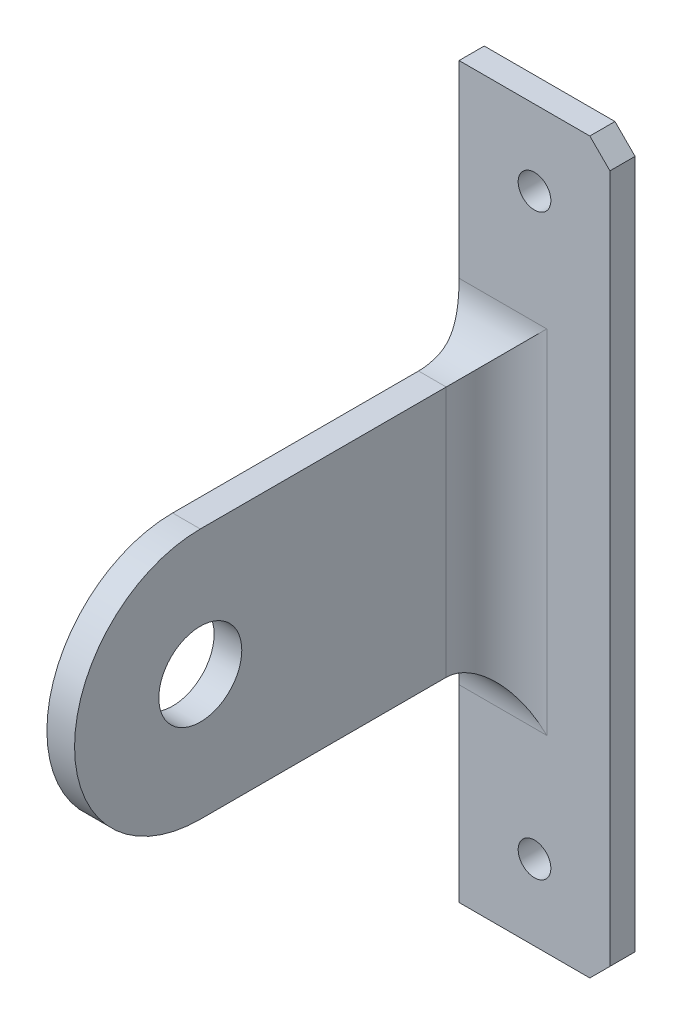
ISO-10303-21;
HEADER;
FILE_DESCRIPTION(('STEP AP214'),'2;1');
FILE_NAME('part.step','',(''),(''),'','','');
FILE_SCHEMA(('AUTOMOTIVE_DESIGN { 1 0 10303 214 1 1 1 1 }'));
ENDSEC;
DATA;
#1=APPLICATION_CONTEXT('core data for automotive mechanical design processes');
#2=APPLICATION_PROTOCOL_DEFINITION('international standard','automotive_design',2000,#1);
#3=PRODUCT_CONTEXT('',#1,'mechanical');
#4=PRODUCT('Part','Part','',(#3));
#5=PRODUCT_RELATED_PRODUCT_CATEGORY('part','',(#4));
#6=PRODUCT_DEFINITION_FORMATION('','',#4);
#7=PRODUCT_DEFINITION_CONTEXT('part definition',#1,'design');
#8=PRODUCT_DEFINITION('design','',#6,#7);
#9=PRODUCT_DEFINITION_SHAPE('','',#8);
#10=(LENGTH_UNIT() NAMED_UNIT(*) SI_UNIT(.MILLI.,.METRE.));
#11=(NAMED_UNIT(*) PLANE_ANGLE_UNIT() SI_UNIT($,.RADIAN.));
#12=(NAMED_UNIT(*) SI_UNIT($,.STERADIAN.) SOLID_ANGLE_UNIT());
#13=UNCERTAINTY_MEASURE_WITH_UNIT(LENGTH_MEASURE(1.E-05),#10,'distance_accuracy_value','');
#14=(GEOMETRIC_REPRESENTATION_CONTEXT(3) GLOBAL_UNCERTAINTY_ASSIGNED_CONTEXT((#13)) GLOBAL_UNIT_ASSIGNED_CONTEXT((#10,
#11,#12)) REPRESENTATION_CONTEXT('',''));
#15=CARTESIAN_POINT('',(0.,0.,0.));
#16=DIRECTION('',(0.,0.,1.));
#17=DIRECTION('',(1.,0.,0.));
#18=AXIS2_PLACEMENT_3D('',#15,#16,#17);
#19=CARTESIAN_POINT('',(2.75,12.5,-4.125));
#20=DIRECTION('',(-1.,0.,0.));
#21=DIRECTION('',(0.,0.,1.));
#22=AXIS2_PLACEMENT_3D('',#19,#20,#21);
#23=PLANE('',#22);
#24=CARTESIAN_POINT('',(2.75,0.,0.));
#25=DIRECTION('',(1.,0.,0.));
#26=DIRECTION('',(0.,0.,-1.));
#27=AXIS2_PLACEMENT_3D('',#24,#25,#26);
#28=CIRCLE('',#27,4.125);
#29=CARTESIAN_POINT('',(2.75,0.,-4.125));
#30=VERTEX_POINT('',#29);
#31=EDGE_CURVE('E204',#30,#30,#28,.T.);
#32=ORIENTED_EDGE('',*,*,#31,.F.);
#33=EDGE_LOOP('',(#32));
#34=FACE_BOUND('',#33,.T.);
#35=DIRECTION('',(0.,0.,-1.));
#36=VECTOR('',#35,1.);
#37=CARTESIAN_POINT('',(2.75,-12.5,-4.125));
#38=LINE('',#37,#36);
#39=CARTESIAN_POINT('',(2.75,-12.5,0.));
#40=VERTEX_POINT('',#39);
#41=CARTESIAN_POINT('',(2.75,-12.5,-24.45));
#42=VERTEX_POINT('',#41);
#43=EDGE_CURVE('E213',#40,#42,#38,.T.);
#44=ORIENTED_EDGE('',*,*,#43,.T.);
#45=DIRECTION('',(0.,-1.,0.));
#46=VECTOR('',#45,1.);
#47=CARTESIAN_POINT('',(2.75,12.5,-24.45));
#48=LINE('',#47,#46);
#49=CARTESIAN_POINT('',(2.75,12.5,-24.45));
#50=VERTEX_POINT('',#49);
#51=EDGE_CURVE('E255',#42,#50,#48,.F.);
#52=ORIENTED_EDGE('',*,*,#51,.T.);
#53=DIRECTION('',(0.,0.,-1.));
#54=VECTOR('',#53,1.);
#55=CARTESIAN_POINT('',(2.75,12.5,-4.125));
#56=LINE('',#55,#54);
#57=CARTESIAN_POINT('',(2.75,12.5,0.));
#58=VERTEX_POINT('',#57);
#59=EDGE_CURVE('E224',#58,#50,#56,.T.);
#60=ORIENTED_EDGE('',*,*,#59,.F.);
#61=CARTESIAN_POINT('',(2.75,0.,0.));
#62=DIRECTION('',(1.,0.,0.));
#63=DIRECTION('',(0.,0.,-1.));
#64=AXIS2_PLACEMENT_3D('',#61,#62,#63);
#65=CIRCLE('',#64,12.5);
#66=EDGE_CURVE('E214',#58,#40,#65,.T.);
#67=ORIENTED_EDGE('',*,*,#66,.T.);
#68=EDGE_LOOP('',(#44,#52,#60,#67));
#69=FACE_BOUND('',#68,.T.);
#70=ADVANCED_FACE('F45',(#34,#69),#23,.F.);
#71=CARTESIAN_POINT('',(0.,12.5,-4.125));
#72=DIRECTION('',(1.,0.,0.));
#73=DIRECTION('',(0.,0.,-1.));
#74=AXIS2_PLACEMENT_3D('',#71,#72,#73);
#75=PLANE('',#74);
#76=CARTESIAN_POINT('',(0.,0.,0.));
#77=DIRECTION('',(1.,0.,0.));
#78=DIRECTION('',(0.,0.,-1.));
#79=AXIS2_PLACEMENT_3D('',#76,#77,#78);
#80=CIRCLE('',#79,4.125);
#81=CARTESIAN_POINT('',(0.,0.,-4.125));
#82=VERTEX_POINT('',#81);
#83=EDGE_CURVE('E209',#82,#82,#80,.T.);
#84=ORIENTED_EDGE('',*,*,#83,.T.);
#85=EDGE_LOOP('',(#84));
#86=FACE_BOUND('',#85,.T.);
#87=DIRECTION('',(0.,0.,1.));
#88=VECTOR('',#87,1.);
#89=CARTESIAN_POINT('',(0.,12.5,-4.125));
#90=LINE('',#89,#88);
#91=CARTESIAN_POINT('',(0.,12.5,-24.45));
#92=VERTEX_POINT('',#91);
#93=CARTESIAN_POINT('',(0.,12.5,0.));
#94=VERTEX_POINT('',#93);
#95=EDGE_CURVE('E228',#92,#94,#90,.T.);
#96=ORIENTED_EDGE('',*,*,#95,.F.);
#97=CARTESIAN_POINT('',(0.,17.5,-24.45));
#98=DIRECTION('',(1.,0.,0.));
#99=DIRECTION('',(0.,0.,-1.));
#100=AXIS2_PLACEMENT_3D('',#97,#98,#99);
#101=CIRCLE('',#100,5.);
#102=CARTESIAN_POINT('',(0.,12.9352791185284,-26.4904223274257));
#103=VERTEX_POINT('',#102);
#104=EDGE_CURVE('E358',#92,#103,#101,.T.);
#105=ORIENTED_EDGE('',*,*,#104,.T.);
#106=CARTESIAN_POINT('',(0.,12.9352791185284,-26.4904223274257));
#107=CARTESIAN_POINT('',(0.,12.5,-26.4904223274257));
#108=B_SPLINE_CURVE_WITH_KNOTS('',1,(#106,#107),.UNSPECIFIED.,.F.,.F.,(2,2),(0.,1.),.UNSPECIFIED.);
#109=CARTESIAN_POINT('',(0.,12.5,-26.4904223274257));
#110=VERTEX_POINT('',#109);
#111=EDGE_CURVE('E261',#103,#110,#108,.T.);
#112=ORIENTED_EDGE('',*,*,#111,.T.);
#113=DIRECTION('',(0.,-1.,0.));
#114=VECTOR('',#113,1.);
#115=CARTESIAN_POINT('',(0.,12.5,-26.4904223274257));
#116=LINE('',#115,#114);
#117=CARTESIAN_POINT('',(0.,-12.5,-26.4904223274257));
#118=VERTEX_POINT('',#117);
#119=EDGE_CURVE('E249',#110,#118,#116,.T.);
#120=ORIENTED_EDGE('',*,*,#119,.T.);
#121=CARTESIAN_POINT('',(0.,-12.5,-26.4904223274257));
#122=CARTESIAN_POINT('',(0.,-12.9352791185284,-26.4904223274257));
#123=B_SPLINE_CURVE_WITH_KNOTS('',1,(#121,#122),.UNSPECIFIED.,.F.,.F.,(2,2),(0.,1.),.UNSPECIFIED.);
#124=CARTESIAN_POINT('',(0.,-12.9352791185284,-26.4904223274257));
#125=VERTEX_POINT('',#124);
#126=EDGE_CURVE('E266',#118,#125,#123,.T.);
#127=ORIENTED_EDGE('',*,*,#126,.T.);
#128=CARTESIAN_POINT('',(0.,-17.5,-24.45));
#129=DIRECTION('',(1.,0.,0.));
#130=DIRECTION('',(0.,0.,-1.));
#131=AXIS2_PLACEMENT_3D('',#128,#129,#130);
#132=CIRCLE('',#131,5.);
#133=CARTESIAN_POINT('',(0.,-12.5,-24.45));
#134=VERTEX_POINT('',#133);
#135=EDGE_CURVE('E258',#125,#134,#132,.T.);
#136=ORIENTED_EDGE('',*,*,#135,.T.);
#137=DIRECTION('',(0.,0.,1.));
#138=VECTOR('',#137,1.);
#139=CARTESIAN_POINT('',(0.,-12.5,-4.125));
#140=LINE('',#139,#138);
#141=CARTESIAN_POINT('',(0.,-12.5,0.));
#142=VERTEX_POINT('',#141);
#143=EDGE_CURVE('E229',#134,#142,#140,.T.);
#144=ORIENTED_EDGE('',*,*,#143,.T.);
#145=CARTESIAN_POINT('',(0.,0.,0.));
#146=DIRECTION('',(1.,0.,0.));
#147=DIRECTION('',(0.,0.,-1.));
#148=AXIS2_PLACEMENT_3D('',#145,#146,#147);
#149=CIRCLE('',#148,12.5);
#150=EDGE_CURVE('E199',#94,#142,#149,.T.);
#151=ORIENTED_EDGE('',*,*,#150,.F.);
#152=EDGE_LOOP('',(#96,#105,#112,#120,#127,#136,#144,#151));
#153=FACE_BOUND('',#152,.T.);
#154=ADVANCED_FACE('F269',(#86,#153),#75,.F.);
#155=CARTESIAN_POINT('',(2.75,12.5,-31.95));
#156=DIRECTION('',(0.,0.,1.));
#157=DIRECTION('',(1.,0.,0.));
#158=AXIS2_PLACEMENT_3D('',#155,#156,#157);
#159=PLANE('',#158);
#160=CARTESIAN_POINT('',(6.53,-28.75,-31.95));
#161=DIRECTION('',(0.,0.,1.));
#162=DIRECTION('',(-1.,0.,0.));
#163=AXIS2_PLACEMENT_3D('',#160,#161,#162);
#164=CIRCLE('',#163,1.625);
#165=CARTESIAN_POINT('',(4.905,-28.75,-31.95));
#166=VERTEX_POINT('',#165);
#167=EDGE_CURVE('E412',#166,#166,#164,.T.);
#168=ORIENTED_EDGE('',*,*,#167,.T.);
#169=EDGE_LOOP('',(#168));
#170=FACE_BOUND('',#169,.T.);
#171=CARTESIAN_POINT('',(6.53,28.75,-31.95));
#172=DIRECTION('',(0.,0.,-1.));
#173=DIRECTION('',(-1.,0.,0.));
#174=AXIS2_PLACEMENT_3D('',#171,#172,#173);
#175=CIRCLE('',#174,1.625);
#176=CARTESIAN_POINT('',(4.905,28.75,-31.95));
#177=VERTEX_POINT('',#176);
#178=EDGE_CURVE('E403',#177,#177,#175,.T.);
#179=ORIENTED_EDGE('',*,*,#178,.F.);
#180=EDGE_LOOP('',(#179));
#181=FACE_BOUND('',#180,.T.);
#182=DIRECTION('',(0.,-1.,0.));
#183=VECTOR('',#182,1.);
#184=CARTESIAN_POINT('',(14.03,12.5,-31.95));
#185=LINE('',#184,#183);
#186=CARTESIAN_POINT('',(14.03,34.25,-31.95));
#187=VERTEX_POINT('',#186);
#188=CARTESIAN_POINT('',(14.03,-34.25,-31.95));
#189=VERTEX_POINT('',#188);
#190=EDGE_CURVE('E195',#187,#189,#185,.T.);
#191=ORIENTED_EDGE('',*,*,#190,.T.);
#192=DIRECTION('',(0.70710678118655,0.707106781186545,0.));
#193=VECTOR('',#192,1.);
#194=CARTESIAN_POINT('',(14.03,-34.25,-31.95));
#195=LINE('',#194,#193);
#196=CARTESIAN_POINT('',(12.03,-36.25,-31.95));
#197=VERTEX_POINT('',#196);
#198=EDGE_CURVE('E349',#189,#197,#195,.F.);
#199=ORIENTED_EDGE('',*,*,#198,.T.);
#200=DIRECTION('',(1.,0.,0.));
#201=VECTOR('',#200,1.);
#202=CARTESIAN_POINT('',(-0.97,-36.25,-31.95));
#203=LINE('',#202,#201);
#204=CARTESIAN_POINT('',(-0.97,-36.25,-31.95));
#205=VERTEX_POINT('',#204);
#206=EDGE_CURVE('E169',#205,#197,#203,.T.);
#207=ORIENTED_EDGE('',*,*,#206,.F.);
#208=DIRECTION('',(0.,-1.,0.));
#209=VECTOR('',#208,1.);
#210=CARTESIAN_POINT('',(-0.97,12.5,-31.95));
#211=LINE('',#210,#209);
#212=CARTESIAN_POINT('',(-0.97,36.25,-31.95));
#213=VERTEX_POINT('',#212);
#214=EDGE_CURVE('E173',#213,#205,#211,.T.);
#215=ORIENTED_EDGE('',*,*,#214,.F.);
#216=DIRECTION('',(1.,0.,0.));
#217=VECTOR('',#216,1.);
#218=CARTESIAN_POINT('',(14.03,36.25,-31.95));
#219=LINE('',#218,#217);
#220=CARTESIAN_POINT('',(12.03,36.25,-31.95));
#221=VERTEX_POINT('',#220);
#222=EDGE_CURVE('E175',#213,#221,#219,.T.);
#223=ORIENTED_EDGE('',*,*,#222,.T.);
#224=DIRECTION('',(0.707106781186545,-0.70710678118655,0.));
#225=VECTOR('',#224,1.);
#226=CARTESIAN_POINT('',(12.03,36.25,-31.95));
#227=LINE('',#226,#225);
#228=EDGE_CURVE('E352',#221,#187,#227,.T.);
#229=ORIENTED_EDGE('',*,*,#228,.T.);
#230=EDGE_LOOP('',(#191,#199,#207,#215,#223,#229));
#231=FACE_BOUND('',#230,.T.);
#232=ADVANCED_FACE('F279',(#170,#181,#231),#159,.F.);
#233=CARTESIAN_POINT('',(0.,12.5,0.));
#234=DIRECTION('',(0.,1.,0.));
#235=DIRECTION('',(0.,0.,1.));
#236=AXIS2_PLACEMENT_3D('',#233,#234,#235);
#237=PLANE('',#236);
#238=ORIENTED_EDGE('',*,*,#59,.T.);
#239=DIRECTION('',(-1.,0.,0.));
#240=VECTOR('',#239,1.);
#241=CARTESIAN_POINT('',(0.,12.5,-24.45));
#242=LINE('',#241,#240);
#243=EDGE_CURVE('E252',#50,#92,#242,.T.);
#244=ORIENTED_EDGE('',*,*,#243,.T.);
#245=ORIENTED_EDGE('',*,*,#95,.T.);
#246=DIRECTION('',(-1.,0.,0.));
#247=VECTOR('',#246,1.);
#248=CARTESIAN_POINT('',(2.75,12.5,0.));
#249=LINE('',#248,#247);
#250=EDGE_CURVE('E205',#58,#94,#249,.T.);
#251=ORIENTED_EDGE('',*,*,#250,.F.);
#252=EDGE_LOOP('',(#238,#244,#245,#251));
#253=FACE_BOUND('',#252,.T.);
#254=ADVANCED_FACE('F286',(#253),#237,.T.);
#255=CARTESIAN_POINT('',(0.,-12.5,0.));
#256=DIRECTION('',(0.,1.,0.));
#257=DIRECTION('',(0.,0.,1.));
#258=AXIS2_PLACEMENT_3D('',#255,#256,#257);
#259=PLANE('',#258);
#260=ORIENTED_EDGE('',*,*,#143,.F.);
#261=DIRECTION('',(-1.,0.,0.));
#262=VECTOR('',#261,1.);
#263=CARTESIAN_POINT('',(2.75,-12.5,-24.45));
#264=LINE('',#263,#262);
#265=EDGE_CURVE('E245',#134,#42,#264,.F.);
#266=ORIENTED_EDGE('',*,*,#265,.T.);
#267=ORIENTED_EDGE('',*,*,#43,.F.);
#268=DIRECTION('',(-1.,0.,0.));
#269=VECTOR('',#268,1.);
#270=CARTESIAN_POINT('',(2.75,-12.5,0.));
#271=LINE('',#270,#269);
#272=EDGE_CURVE('E200',#40,#142,#271,.T.);
#273=ORIENTED_EDGE('',*,*,#272,.T.);
#274=EDGE_LOOP('',(#260,#266,#267,#273));
#275=FACE_BOUND('',#274,.T.);
#276=ADVANCED_FACE('F281',(#275),#259,.F.);
#277=CARTESIAN_POINT('',(2.75,0.,0.));
#278=DIRECTION('',(-1.,0.,0.));
#279=DIRECTION('',(0.,0.,1.));
#280=AXIS2_PLACEMENT_3D('',#277,#278,#279);
#281=CYLINDRICAL_SURFACE('',#280,12.5);
#282=ORIENTED_EDGE('',*,*,#150,.T.);
#283=ORIENTED_EDGE('',*,*,#272,.F.);
#284=ORIENTED_EDGE('',*,*,#66,.F.);
#285=ORIENTED_EDGE('',*,*,#250,.T.);
#286=EDGE_LOOP('',(#282,#283,#284,#285));
#287=FACE_BOUND('',#286,.T.);
#288=ADVANCED_FACE('F384',(#287),#281,.T.);
#289=CARTESIAN_POINT('',(2.75,0.,0.));
#290=DIRECTION('',(-1.,0.,0.));
#291=DIRECTION('',(0.,0.,1.));
#292=AXIS2_PLACEMENT_3D('',#289,#290,#291);
#293=CYLINDRICAL_SURFACE('',#292,4.125);
#294=ORIENTED_EDGE('',*,*,#31,.T.);
#295=EDGE_LOOP('',(#294));
#296=FACE_BOUND('',#295,.T.);
#297=ORIENTED_EDGE('',*,*,#83,.F.);
#298=EDGE_LOOP('',(#297));
#299=FACE_BOUND('',#298,.T.);
#300=ADVANCED_FACE('F430',(#296,#299),#293,.F.);
#301=CARTESIAN_POINT('',(-0.97,12.5,-31.95));
#302=DIRECTION('',(1.,0.,0.));
#303=DIRECTION('',(0.,0.,-1.));
#304=AXIS2_PLACEMENT_3D('',#301,#302,#303);
#305=PLANE('',#304);
#306=ORIENTED_EDGE('',*,*,#214,.T.);
#307=DIRECTION('',(0.,0.,-1.));
#308=VECTOR('',#307,1.);
#309=CARTESIAN_POINT('',(-0.97,-36.25,-29.45));
#310=LINE('',#309,#308);
#311=CARTESIAN_POINT('',(-0.97,-36.25,-29.45));
#312=VERTEX_POINT('',#311);
#313=EDGE_CURVE('E166',#312,#205,#310,.T.);
#314=ORIENTED_EDGE('',*,*,#313,.F.);
#315=DIRECTION('',(0.,-1.,0.));
#316=VECTOR('',#315,1.);
#317=CARTESIAN_POINT('',(-0.97,12.5,-29.45));
#318=LINE('',#317,#316);
#319=CARTESIAN_POINT('',(-0.97,-17.5,-29.45));
#320=VERTEX_POINT('',#319);
#321=EDGE_CURVE('E151',#320,#312,#318,.T.);
#322=ORIENTED_EDGE('',*,*,#321,.F.);
#323=CARTESIAN_POINT('',(-0.97,17.5,-29.45));
#324=VERTEX_POINT('',#323);
#325=EDGE_CURVE('E160',#324,#320,#318,.T.);
#326=ORIENTED_EDGE('',*,*,#325,.F.);
#327=CARTESIAN_POINT('',(-0.97,36.25,-29.45));
#328=VERTEX_POINT('',#327);
#329=EDGE_CURVE('E163',#328,#324,#318,.T.);
#330=ORIENTED_EDGE('',*,*,#329,.F.);
#331=DIRECTION('',(0.,0.,-1.));
#332=VECTOR('',#331,1.);
#333=CARTESIAN_POINT('',(-0.97,36.25,-29.45));
#334=LINE('',#333,#332);
#335=EDGE_CURVE('E184',#328,#213,#334,.T.);
#336=ORIENTED_EDGE('',*,*,#335,.T.);
#337=EDGE_LOOP('',(#306,#314,#322,#326,#330,#336));
#338=FACE_BOUND('',#337,.T.);
#339=ADVANCED_FACE('F171',(#338),#305,.F.);
#340=CARTESIAN_POINT('',(14.03,12.5,-29.45));
#341=DIRECTION('',(0.,0.,-1.));
#342=DIRECTION('',(-1.,0.,0.));
#343=AXIS2_PLACEMENT_3D('',#340,#341,#342);
#344=PLANE('',#343);
#345=CARTESIAN_POINT('',(6.53,-28.75,-29.45));
#346=DIRECTION('',(0.,0.,1.));
#347=DIRECTION('',(-1.,0.,0.));
#348=AXIS2_PLACEMENT_3D('',#345,#346,#347);
#349=CIRCLE('',#348,1.625);
#350=CARTESIAN_POINT('',(4.905,-28.75,-29.45));
#351=VERTEX_POINT('',#350);
#352=EDGE_CURVE('E409',#351,#351,#349,.T.);
#353=ORIENTED_EDGE('',*,*,#352,.F.);
#354=EDGE_LOOP('',(#353));
#355=FACE_BOUND('',#354,.T.);
#356=CARTESIAN_POINT('',(6.53,28.75,-29.45));
#357=DIRECTION('',(0.,0.,-1.));
#358=DIRECTION('',(-1.,0.,0.));
#359=AXIS2_PLACEMENT_3D('',#356,#357,#358);
#360=CIRCLE('',#359,1.625);
#361=CARTESIAN_POINT('',(4.905,28.75,-29.45));
#362=VERTEX_POINT('',#361);
#363=EDGE_CURVE('E400',#362,#362,#360,.T.);
#364=ORIENTED_EDGE('',*,*,#363,.T.);
#365=EDGE_LOOP('',(#364));
#366=FACE_BOUND('',#365,.T.);
#367=DIRECTION('',(1.,0.,0.));
#368=VECTOR('',#367,1.);
#369=CARTESIAN_POINT('',(14.03,-36.25,-29.45));
#370=LINE('',#369,#368);
#371=CARTESIAN_POINT('',(12.03,-36.25,-29.45));
#372=VERTEX_POINT('',#371);
#373=EDGE_CURVE('E153',#312,#372,#370,.T.);
#374=ORIENTED_EDGE('',*,*,#373,.T.);
#375=DIRECTION('',(-0.70710678118655,-0.707106781186545,0.));
#376=VECTOR('',#375,1.);
#377=CARTESIAN_POINT('',(14.03,-34.25,-29.45));
#378=LINE('',#377,#376);
#379=CARTESIAN_POINT('',(14.03,-34.25,-29.45));
#380=VERTEX_POINT('',#379);
#381=EDGE_CURVE('E55',#372,#380,#378,.F.);
#382=ORIENTED_EDGE('',*,*,#381,.T.);
#383=DIRECTION('',(0.,-1.,0.));
#384=VECTOR('',#383,1.);
#385=CARTESIAN_POINT('',(14.03,12.5,-29.45));
#386=LINE('',#385,#384);
#387=CARTESIAN_POINT('',(14.03,34.25,-29.45));
#388=VERTEX_POINT('',#387);
#389=EDGE_CURVE('E161',#388,#380,#386,.T.);
#390=ORIENTED_EDGE('',*,*,#389,.F.);
#391=DIRECTION('',(-0.707106781186545,0.70710678118655,0.));
#392=VECTOR('',#391,1.);
#393=CARTESIAN_POINT('',(12.03,36.25,-29.45));
#394=LINE('',#393,#392);
#395=CARTESIAN_POINT('',(12.03,36.25,-29.45));
#396=VERTEX_POINT('',#395);
#397=EDGE_CURVE('E62',#388,#396,#394,.T.);
#398=ORIENTED_EDGE('',*,*,#397,.T.);
#399=DIRECTION('',(1.,0.,0.));
#400=VECTOR('',#399,1.);
#401=CARTESIAN_POINT('',(-0.97,36.25,-29.45));
#402=LINE('',#401,#400);
#403=EDGE_CURVE('E179',#328,#396,#402,.T.);
#404=ORIENTED_EDGE('',*,*,#403,.F.);
#405=ORIENTED_EDGE('',*,*,#329,.T.);
#406=DIRECTION('',(-1.,0.,0.));
#407=VECTOR('',#406,1.);
#408=CARTESIAN_POINT('',(14.03,17.5,-29.45));
#409=LINE('',#408,#407);
#410=CARTESIAN_POINT('',(7.75,17.5,-29.45));
#411=VERTEX_POINT('',#410);
#412=EDGE_CURVE('E240',#324,#411,#409,.F.);
#413=ORIENTED_EDGE('',*,*,#412,.T.);
#414=DIRECTION('',(0.,-1.,0.));
#415=VECTOR('',#414,1.);
#416=CARTESIAN_POINT('',(7.75,-12.5,-29.45));
#417=LINE('',#416,#415);
#418=CARTESIAN_POINT('',(7.75,-17.5,-29.45));
#419=VERTEX_POINT('',#418);
#420=EDGE_CURVE('E232',#411,#419,#417,.T.);
#421=ORIENTED_EDGE('',*,*,#420,.T.);
#422=DIRECTION('',(-1.,0.,0.));
#423=VECTOR('',#422,1.);
#424=CARTESIAN_POINT('',(0.,-17.5,-29.45));
#425=LINE('',#424,#423);
#426=EDGE_CURVE('E156',#419,#320,#425,.T.);
#427=ORIENTED_EDGE('',*,*,#426,.T.);
#428=ORIENTED_EDGE('',*,*,#321,.T.);
#429=EDGE_LOOP('',(#374,#382,#390,#398,#404,#405,#413,#421,#427,#428));
#430=FACE_BOUND('',#429,.T.);
#431=ADVANCED_FACE('F152',(#355,#366,#430),#344,.F.);
#432=CARTESIAN_POINT('',(14.03,12.5,-31.95));
#433=DIRECTION('',(-1.,0.,0.));
#434=DIRECTION('',(0.,0.,1.));
#435=AXIS2_PLACEMENT_3D('',#432,#433,#434);
#436=PLANE('',#435);
#437=ORIENTED_EDGE('',*,*,#389,.T.);
#438=DIRECTION('',(0.,0.,-1.));
#439=VECTOR('',#438,1.);
#440=CARTESIAN_POINT('',(14.03,-34.25,-31.95));
#441=LINE('',#440,#439);
#442=EDGE_CURVE('E342',#380,#189,#441,.T.);
#443=ORIENTED_EDGE('',*,*,#442,.T.);
#444=ORIENTED_EDGE('',*,*,#190,.F.);
#445=DIRECTION('',(0.,0.,1.));
#446=VECTOR('',#445,1.);
#447=CARTESIAN_POINT('',(14.03,34.25,-29.45));
#448=LINE('',#447,#446);
#449=EDGE_CURVE('E356',#187,#388,#448,.T.);
#450=ORIENTED_EDGE('',*,*,#449,.T.);
#451=EDGE_LOOP('',(#437,#443,#444,#450));
#452=FACE_BOUND('',#451,.T.);
#453=ADVANCED_FACE('F423',(#452),#436,.F.);
#454=CARTESIAN_POINT('',(14.03,36.25,-29.45));
#455=DIRECTION('',(0.,1.,0.));
#456=DIRECTION('',(0.,0.,1.));
#457=AXIS2_PLACEMENT_3D('',#454,#455,#456);
#458=PLANE('',#457);
#459=ORIENTED_EDGE('',*,*,#403,.T.);
#460=DIRECTION('',(0.,0.,-1.));
#461=VECTOR('',#460,1.);
#462=CARTESIAN_POINT('',(12.03,36.25,-31.95));
#463=LINE('',#462,#461);
#464=EDGE_CURVE('E11',#396,#221,#463,.T.);
#465=ORIENTED_EDGE('',*,*,#464,.T.);
#466=ORIENTED_EDGE('',*,*,#222,.F.);
#467=ORIENTED_EDGE('',*,*,#335,.F.);
#468=EDGE_LOOP('',(#459,#465,#466,#467));
#469=FACE_BOUND('',#468,.T.);
#470=ADVANCED_FACE('F396',(#469),#458,.T.);
#471=CARTESIAN_POINT('',(-0.97,-36.25,-29.45));
#472=DIRECTION('',(0.,1.,0.));
#473=DIRECTION('',(0.,0.,1.));
#474=AXIS2_PLACEMENT_3D('',#471,#472,#473);
#475=PLANE('',#474);
#476=ORIENTED_EDGE('',*,*,#206,.T.);
#477=DIRECTION('',(0.,0.,1.));
#478=VECTOR('',#477,1.);
#479=CARTESIAN_POINT('',(12.03,-36.25,-29.45));
#480=LINE('',#479,#478);
#481=EDGE_CURVE('E70',#197,#372,#480,.T.);
#482=ORIENTED_EDGE('',*,*,#481,.T.);
#483=ORIENTED_EDGE('',*,*,#373,.F.);
#484=ORIENTED_EDGE('',*,*,#313,.T.);
#485=EDGE_LOOP('',(#476,#482,#483,#484));
#486=FACE_BOUND('',#485,.T.);
#487=ADVANCED_FACE('F165',(#486),#475,.F.);
#488=CARTESIAN_POINT('',(6.53,28.75,-29.45));
#489=DIRECTION('',(0.,0.,-1.));
#490=DIRECTION('',(-1.,0.,0.));
#491=AXIS2_PLACEMENT_3D('',#488,#489,#490);
#492=CYLINDRICAL_SURFACE('',#491,1.625);
#493=ORIENTED_EDGE('',*,*,#363,.F.);
#494=EDGE_LOOP('',(#493));
#495=FACE_BOUND('',#494,.T.);
#496=ORIENTED_EDGE('',*,*,#178,.T.);
#497=EDGE_LOOP('',(#496));
#498=FACE_BOUND('',#497,.T.);
#499=ADVANCED_FACE('F522',(#495,#498),#492,.F.);
#500=CARTESIAN_POINT('',(6.53,-28.75,-29.45));
#501=DIRECTION('',(0.,0.,-1.));
#502=DIRECTION('',(-1.,0.,0.));
#503=AXIS2_PLACEMENT_3D('',#500,#501,#502);
#504=CYLINDRICAL_SURFACE('',#503,1.625);
#505=ORIENTED_EDGE('',*,*,#352,.T.);
#506=EDGE_LOOP('',(#505));
#507=FACE_BOUND('',#506,.T.);
#508=ORIENTED_EDGE('',*,*,#167,.F.);
#509=EDGE_LOOP('',(#508));
#510=FACE_BOUND('',#509,.T.);
#511=ADVANCED_FACE('F324',(#507,#510),#504,.F.);
#512=CARTESIAN_POINT('',(0.,17.5,-24.45));
#513=DIRECTION('',(-1.,0.,0.));
#514=DIRECTION('',(0.,0.,1.));
#515=AXIS2_PLACEMENT_3D('',#512,#513,#514);
#516=CYLINDRICAL_SURFACE('',#515,5.);
#517=ORIENTED_EDGE('',*,*,#104,.F.);
#518=ORIENTED_EDGE('',*,*,#243,.F.);
#519=CARTESIAN_POINT('',(7.75,17.5,-24.45));
#520=DIRECTION('',(-0.707106781186547,0.707106781186547,0.));
#521=DIRECTION('',(0.707106781186547,0.707106781186547,0.));
#522=AXIS2_PLACEMENT_3D('',#519,#520,#521);
#523=ELLIPSE('',#522,7.07106781186547,5.);
#524=EDGE_CURVE('E317',#411,#50,#523,.T.);
#525=ORIENTED_EDGE('',*,*,#524,.F.);
#526=ORIENTED_EDGE('',*,*,#412,.F.);
#527=CARTESIAN_POINT('',(-0.97,17.5,-29.45));
#528=CARTESIAN_POINT('',(-0.970079899164056,17.3701049038207,-29.4500301365659));
#529=CARTESIAN_POINT('',(-0.966284576796977,17.2402500129345,-29.444939803141));
#530=CARTESIAN_POINT('',(-0.951551204793543,16.9818840424503,-29.4247605335802));
#531=CARTESIAN_POINT('',(-0.940622043722495,16.8533714925146,-29.409684039579));
#532=CARTESIAN_POINT('',(-0.912352046299374,16.5997565240031,-29.3699509679432));
#533=CARTESIAN_POINT('',(-0.895069028094303,16.4746339537154,-29.3453806810961));
#534=CARTESIAN_POINT('',(-0.855082497576353,16.2274269727635,-29.2870124477417));
#535=CARTESIAN_POINT('',(-0.832377482086573,16.105343415008,-29.2532119419049));
#536=CARTESIAN_POINT('',(-0.782816880609937,15.8654559815642,-29.1769477642139));
#537=CARTESIAN_POINT('',(-0.755981566245618,15.747634500377,-29.1345260958268));
#538=CARTESIAN_POINT('',(-0.699294757293463,15.516152033476,-29.0412870186986));
#539=CARTESIAN_POINT('',(-0.66944340943242,15.4024908457345,-28.9904700183051));
#540=CARTESIAN_POINT('',(-0.57696028922591,15.0675079823907,-28.8255122349336));
#541=CARTESIAN_POINT('',(-0.511559151953342,14.8528962193414,-28.6990922281402));
#542=CARTESIAN_POINT('',(-0.374301258983328,14.4173656935916,-28.3967087622663));
#543=CARTESIAN_POINT('',(-0.302726350453535,14.1993278789313,-28.2164166862097));
#544=CARTESIAN_POINT('',(-0.207238058290553,13.8961997256557,-27.9188054355513));
#545=CARTESIAN_POINT('',(-0.177418352421783,13.7992543282084,-27.8152232280683));
#546=CARTESIAN_POINT('',(-0.123261300433566,13.6139193241557,-27.5993808257014));
#547=CARTESIAN_POINT('',(-0.0989212666786567,13.5255255353961,-27.4871249214883));
#548=CARTESIAN_POINT('',(-0.0537066998880335,13.3435807966599,-27.234315876693));
#549=CARTESIAN_POINT('',(-0.0341646858240219,13.2517928573734,-27.092231038347));
#550=CARTESIAN_POINT('',(-0.0140201579687512,13.1248539090104,-26.8718450740968));
#551=CARTESIAN_POINT('',(-0.00883237271217802,13.0842682072443,-26.7970322882268));
#552=CARTESIAN_POINT('',(-0.00182011807073649,13.0068846804583,-26.6452626313622));
#553=CARTESIAN_POINT('',(2.25806700241875E-06,12.970089226354,-26.5683044561425));
#554=CARTESIAN_POINT('',(0.,12.9352791185284,-26.4904223274257));
#555=B_SPLINE_CURVE_WITH_KNOTS('',3,(#527,#528,#529,#530,#531,#532,#533,#534,#535,#536,#537,
#538,#539,#540,#541,#542,#543,#544,#545,#546,#547,#548,#549,#550,#551,#552,#553,#554),
.UNSPECIFIED.,.F.,.F.,(4,2,2,2,2,2,2,2,2,2,2,2,2,4),(0.,0.389466311164096,0.77844828202075,
1.16397487652975,1.54960847751762,1.93340642142806,2.31718570296248,3.08700618817996,
3.95804575551257,4.39245108998988,4.82664289359202,5.33611464761218,5.59177105585042,
5.84758642604938),.UNSPECIFIED.);
#556=EDGE_CURVE('E309',#103,#324,#555,.F.);
#557=ORIENTED_EDGE('',*,*,#556,.F.);
#558=EDGE_LOOP('',(#517,#518,#525,#526,#557));
#559=FACE_BOUND('',#558,.T.);
#560=ADVANCED_FACE('F320',(#559),#516,.F.);
#561=CARTESIAN_POINT('',(7.75,12.5,-24.45));
#562=DIRECTION('',(0.,1.,0.));
#563=DIRECTION('',(0.,0.,1.));
#564=AXIS2_PLACEMENT_3D('',#561,#562,#563);
#565=CYLINDRICAL_SURFACE('',#564,5.);
#566=ORIENTED_EDGE('',*,*,#524,.T.);
#567=ORIENTED_EDGE('',*,*,#51,.F.);
#568=CARTESIAN_POINT('',(7.75,-17.5,-24.45));
#569=DIRECTION('',(0.707106781186547,0.707106781186547,0.));
#570=DIRECTION('',(-0.707106781186547,0.707106781186547,0.));
#571=AXIS2_PLACEMENT_3D('',#568,#569,#570);
#572=ELLIPSE('',#571,7.07106781186547,5.);
#573=EDGE_CURVE('E318',#419,#42,#572,.T.);
#574=ORIENTED_EDGE('',*,*,#573,.F.);
#575=ORIENTED_EDGE('',*,*,#420,.F.);
#576=EDGE_LOOP('',(#566,#567,#574,#575));
#577=FACE_BOUND('',#576,.T.);
#578=ADVANCED_FACE('F296',(#577),#565,.F.);
#579=CARTESIAN_POINT('',(-5.,12.5,-26.4904223274257));
#580=DIRECTION('',(0.,-1.,0.));
#581=DIRECTION('',(0.,0.,-1.));
#582=AXIS2_PLACEMENT_3D('',#579,#580,#581);
#583=CYLINDRICAL_SURFACE('',#582,5.);
#584=ORIENTED_EDGE('',*,*,#556,.T.);
#585=ORIENTED_EDGE('',*,*,#325,.T.);
#586=CARTESIAN_POINT('',(-0.97,-17.5,-29.45));
#587=CARTESIAN_POINT('',(-0.970079899164056,-17.3701049038207,-29.4500301365659));
#588=CARTESIAN_POINT('',(-0.966284576796977,-17.2402500129345,-29.444939803141));
#589=CARTESIAN_POINT('',(-0.951551204793543,-16.9818840424503,-29.4247605335802));
#590=CARTESIAN_POINT('',(-0.940622043722495,-16.8533714925146,-29.409684039579));
#591=CARTESIAN_POINT('',(-0.912352046299374,-16.5997565240031,-29.3699509679432));
#592=CARTESIAN_POINT('',(-0.895069028094303,-16.4746339537154,-29.3453806810961));
#593=CARTESIAN_POINT('',(-0.855082497576353,-16.2274269727635,-29.2870124477417));
#594=CARTESIAN_POINT('',(-0.832377482086573,-16.105343415008,-29.2532119419049));
#595=CARTESIAN_POINT('',(-0.782816880609937,-15.8654559815642,-29.1769477642139));
#596=CARTESIAN_POINT('',(-0.755981566245618,-15.747634500377,-29.1345260958268));
#597=CARTESIAN_POINT('',(-0.699294757293463,-15.516152033476,-29.0412870186986));
#598=CARTESIAN_POINT('',(-0.66944340943242,-15.4024908457345,-28.9904700183051));
#599=CARTESIAN_POINT('',(-0.57696028922591,-15.0675079823907,-28.8255122349336));
#600=CARTESIAN_POINT('',(-0.511559151953341,-14.8528962193414,-28.6990922281402));
#601=CARTESIAN_POINT('',(-0.374301258983328,-14.4173656935916,-28.3967087622663));
#602=CARTESIAN_POINT('',(-0.302726350453535,-14.1993278789313,-28.2164166862097));
#603=CARTESIAN_POINT('',(-0.207238058290553,-13.8961997256557,-27.9188054355513));
#604=CARTESIAN_POINT('',(-0.177418352421783,-13.7992543282084,-27.8152232280683));
#605=CARTESIAN_POINT('',(-0.123261300433566,-13.6139193241557,-27.5993808257014));
#606=CARTESIAN_POINT('',(-0.0989212666786568,-13.5255255353961,-27.4871249214883));
#607=CARTESIAN_POINT('',(-0.0537066998880336,-13.3435807966599,-27.234315876693));
#608=CARTESIAN_POINT('',(-0.034164685824022,-13.2517928573734,-27.092231038347));
#609=CARTESIAN_POINT('',(-0.0140201579687513,-13.1248539090104,-26.8718450740968));
#610=CARTESIAN_POINT('',(-0.00883237271217809,-13.0842682072443,-26.7970322882268));
#611=CARTESIAN_POINT('',(-0.00182011807073658,-13.0068846804583,-26.6452626313622));
#612=CARTESIAN_POINT('',(2.25806700232282E-06,-12.970089226354,-26.5683044561425));
#613=CARTESIAN_POINT('',(0.,-12.9352791185284,-26.4904223274257));
#614=B_SPLINE_CURVE_WITH_KNOTS('',3,(#586,#587,#588,#589,#590,#591,#592,#593,#594,#595,#596,
#597,#598,#599,#600,#601,#602,#603,#604,#605,#606,#607,#608,#609,#610,#611,#612,#613),
.UNSPECIFIED.,.F.,.F.,(4,2,2,2,2,2,2,2,2,2,2,2,2,4),(0.,0.389466311164096,0.77844828202075,
1.16397487652975,1.54960847751762,1.93340642142806,2.31718570296248,3.08700618817996,
3.95804575551257,4.39245108998988,4.82664289359202,5.33611464761218,5.59177105585042,
5.84758642604938),.UNSPECIFIED.);
#615=EDGE_CURVE('E302',#125,#320,#614,.F.);
#616=ORIENTED_EDGE('',*,*,#615,.F.);
#617=ORIENTED_EDGE('',*,*,#126,.F.);
#618=ORIENTED_EDGE('',*,*,#119,.F.);
#619=ORIENTED_EDGE('',*,*,#111,.F.);
#620=EDGE_LOOP('',(#584,#585,#616,#617,#618,#619));
#621=FACE_BOUND('',#620,.T.);
#622=ADVANCED_FACE('F291',(#621),#583,.F.);
#623=CARTESIAN_POINT('',(14.03,-17.5,-24.45));
#624=DIRECTION('',(1.,0.,0.));
#625=DIRECTION('',(0.,0.,-1.));
#626=AXIS2_PLACEMENT_3D('',#623,#624,#625);
#627=CYLINDRICAL_SURFACE('',#626,5.);
#628=ORIENTED_EDGE('',*,*,#573,.T.);
#629=ORIENTED_EDGE('',*,*,#265,.F.);
#630=ORIENTED_EDGE('',*,*,#135,.F.);
#631=ORIENTED_EDGE('',*,*,#615,.T.);
#632=ORIENTED_EDGE('',*,*,#426,.F.);
#633=EDGE_LOOP('',(#628,#629,#630,#631,#632));
#634=FACE_BOUND('',#633,.T.);
#635=ADVANCED_FACE('F295',(#634),#627,.F.);
#636=CARTESIAN_POINT('',(14.03,-34.25,-31.95));
#637=DIRECTION('',(-0.707106781186545,0.70710678118655,0.));
#638=DIRECTION('',(0.,0.,-1.));
#639=AXIS2_PLACEMENT_3D('',#636,#637,#638);
#640=PLANE('',#639);
#641=ORIENTED_EDGE('',*,*,#381,.F.);
#642=ORIENTED_EDGE('',*,*,#481,.F.);
#643=ORIENTED_EDGE('',*,*,#198,.F.);
#644=ORIENTED_EDGE('',*,*,#442,.F.);
#645=EDGE_LOOP('',(#641,#642,#643,#644));
#646=FACE_BOUND('',#645,.T.);
#647=ADVANCED_FACE('F329',(#646),#640,.F.);
#648=CARTESIAN_POINT('',(12.03,36.25,-29.45));
#649=DIRECTION('',(0.70710678118655,0.707106781186545,0.));
#650=DIRECTION('',(0.,0.,1.));
#651=AXIS2_PLACEMENT_3D('',#648,#649,#650);
#652=PLANE('',#651);
#653=ORIENTED_EDGE('',*,*,#397,.F.);
#654=ORIENTED_EDGE('',*,*,#449,.F.);
#655=ORIENTED_EDGE('',*,*,#228,.F.);
#656=ORIENTED_EDGE('',*,*,#464,.F.);
#657=EDGE_LOOP('',(#653,#654,#655,#656));
#658=FACE_BOUND('',#657,.T.);
#659=ADVANCED_FACE('F48',(#658),#652,.T.);
#660=CLOSED_SHELL('',(#70,#154,#232,#254,#276,#288,#300,#339,#431,#453,#470,#487,#499,#511,#560,
#578,#622,#635,#647,#659));
#661=MANIFOLD_SOLID_BREP('B2',#660);
#662=ADVANCED_BREP_SHAPE_REPRESENTATION('',(#18,#661),#14);
#663=SHAPE_DEFINITION_REPRESENTATION(#9,#662);
ENDSEC;
END-ISO-10303-21;
